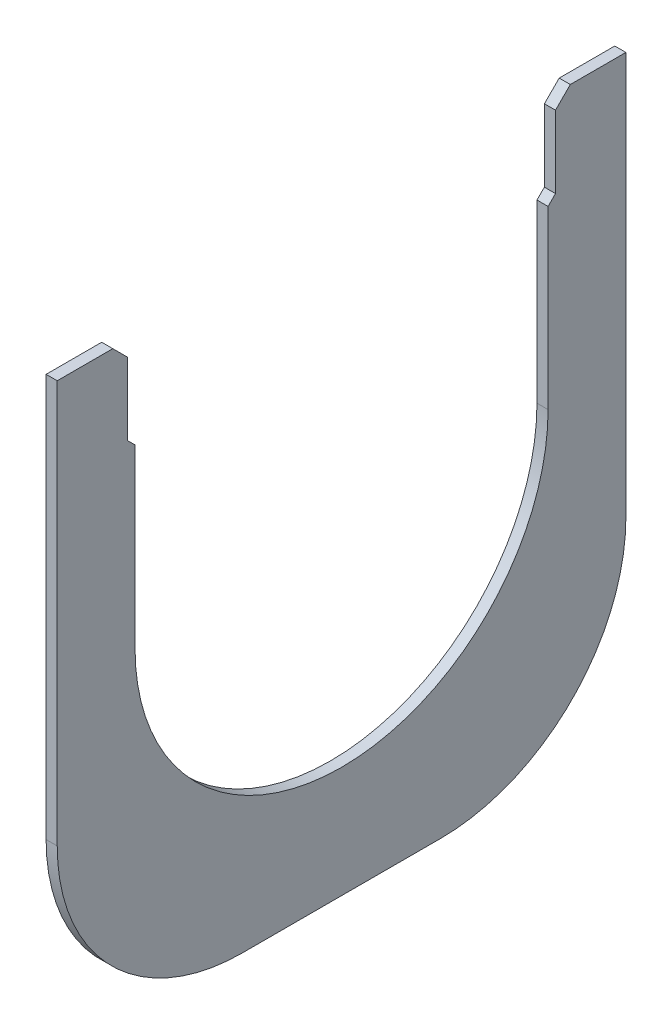
ISO-10303-21;
HEADER;
FILE_DESCRIPTION(('STEP AP214'),'2;1');
FILE_NAME('part.step','',(''),(''),'','','');
FILE_SCHEMA(('AUTOMOTIVE_DESIGN { 1 0 10303 214 1 1 1 1 }'));
ENDSEC;
DATA;
#1=APPLICATION_CONTEXT('core data for automotive mechanical design processes');
#2=APPLICATION_PROTOCOL_DEFINITION('international standard','automotive_design',2000,#1);
#3=PRODUCT_CONTEXT('',#1,'mechanical');
#4=PRODUCT('Part','Part','',(#3));
#5=PRODUCT_RELATED_PRODUCT_CATEGORY('part','',(#4));
#6=PRODUCT_DEFINITION_FORMATION('','',#4);
#7=PRODUCT_DEFINITION_CONTEXT('part definition',#1,'design');
#8=PRODUCT_DEFINITION('design','',#6,#7);
#9=PRODUCT_DEFINITION_SHAPE('','',#8);
#10=(LENGTH_UNIT() NAMED_UNIT(*) SI_UNIT(.MILLI.,.METRE.));
#11=(NAMED_UNIT(*) PLANE_ANGLE_UNIT() SI_UNIT($,.RADIAN.));
#12=(NAMED_UNIT(*) SI_UNIT($,.STERADIAN.) SOLID_ANGLE_UNIT());
#13=UNCERTAINTY_MEASURE_WITH_UNIT(LENGTH_MEASURE(1.E-05),#10,'distance_accuracy_value','');
#14=(GEOMETRIC_REPRESENTATION_CONTEXT(3) GLOBAL_UNCERTAINTY_ASSIGNED_CONTEXT((#13)) GLOBAL_UNIT_ASSIGNED_CONTEXT((#10,
#11,#12)) REPRESENTATION_CONTEXT('',''));
#15=CARTESIAN_POINT('',(0.,0.,0.));
#16=DIRECTION('',(0.,0.,1.));
#17=DIRECTION('',(1.,0.,0.));
#18=AXIS2_PLACEMENT_3D('',#15,#16,#17);
#19=CARTESIAN_POINT('',(-3.,146.,111.5));
#20=DIRECTION('',(0.,1.,0.));
#21=DIRECTION('',(0.,0.,1.));
#22=AXIS2_PLACEMENT_3D('',#19,#20,#21);
#23=PLANE('',#22);
#24=DIRECTION('',(0.,0.,1.));
#25=VECTOR('',#24,1.);
#26=CARTESIAN_POINT('',(3.,146.,111.5));
#27=LINE('',#26,#25);
#28=CARTESIAN_POINT('',(3.,146.,123.5));
#29=VERTEX_POINT('',#28);
#30=CARTESIAN_POINT('',(3.,146.,153.5));
#31=VERTEX_POINT('',#30);
#32=EDGE_CURVE('E198',#29,#31,#27,.T.);
#33=ORIENTED_EDGE('',*,*,#32,.F.);
#34=DIRECTION('',(-1.,0.,0.));
#35=VECTOR('',#34,1.);
#36=CARTESIAN_POINT('',(-3.,146.,123.5));
#37=LINE('',#36,#35);
#38=CARTESIAN_POINT('',(-3.,146.,123.5));
#39=VERTEX_POINT('',#38);
#40=EDGE_CURVE('E183',#29,#39,#37,.T.);
#41=ORIENTED_EDGE('',*,*,#40,.T.);
#42=DIRECTION('',(0.,0.,1.));
#43=VECTOR('',#42,1.);
#44=CARTESIAN_POINT('',(-3.,146.,111.5));
#45=LINE('',#44,#43);
#46=CARTESIAN_POINT('',(-3.,146.,153.5));
#47=VERTEX_POINT('',#46);
#48=EDGE_CURVE('E218',#39,#47,#45,.T.);
#49=ORIENTED_EDGE('',*,*,#48,.T.);
#50=DIRECTION('',(1.,0.,0.));
#51=VECTOR('',#50,1.);
#52=CARTESIAN_POINT('',(-3.,146.,153.5));
#53=LINE('',#52,#51);
#54=EDGE_CURVE('E254',#47,#31,#53,.T.);
#55=ORIENTED_EDGE('',*,*,#54,.T.);
#56=EDGE_LOOP('',(#33,#41,#49,#55));
#57=FACE_BOUND('',#56,.T.);
#58=ADVANCED_FACE('F53',(#57),#23,.T.);
#59=CARTESIAN_POINT('',(-3.,0.,111.5));
#60=DIRECTION('',(0.,0.,-1.));
#61=DIRECTION('',(-1.,0.,0.));
#62=AXIS2_PLACEMENT_3D('',#59,#60,#61);
#63=PLANE('',#62);
#64=DIRECTION('',(0.,1.,0.));
#65=VECTOR('',#64,1.);
#66=CARTESIAN_POINT('',(-3.,0.,111.5));
#67=LINE('',#66,#65);
#68=CARTESIAN_POINT('',(-3.,0.,111.5));
#69=VERTEX_POINT('',#68);
#70=CARTESIAN_POINT('',(-3.,95.,111.5));
#71=VERTEX_POINT('',#70);
#72=EDGE_CURVE('E252',#69,#71,#67,.T.);
#73=ORIENTED_EDGE('',*,*,#72,.T.);
#74=DIRECTION('',(1.,0.,0.));
#75=VECTOR('',#74,1.);
#76=CARTESIAN_POINT('',(3.,95.,111.5));
#77=LINE('',#76,#75);
#78=CARTESIAN_POINT('',(3.,95.,111.5));
#79=VERTEX_POINT('',#78);
#80=EDGE_CURVE('E11',#71,#79,#77,.T.);
#81=ORIENTED_EDGE('',*,*,#80,.T.);
#82=DIRECTION('',(0.,1.,0.));
#83=VECTOR('',#82,1.);
#84=CARTESIAN_POINT('',(3.,0.,111.5));
#85=LINE('',#84,#83);
#86=CARTESIAN_POINT('',(3.,0.,111.5));
#87=VERTEX_POINT('',#86);
#88=EDGE_CURVE('E177',#87,#79,#85,.T.);
#89=ORIENTED_EDGE('',*,*,#88,.F.);
#90=DIRECTION('',(1.,0.,0.));
#91=VECTOR('',#90,1.);
#92=CARTESIAN_POINT('',(-3.,0.,111.5));
#93=LINE('',#92,#91);
#94=EDGE_CURVE('E287',#69,#87,#93,.T.);
#95=ORIENTED_EDGE('',*,*,#94,.F.);
#96=EDGE_LOOP('',(#73,#81,#89,#95));
#97=FACE_BOUND('',#96,.T.);
#98=ADVANCED_FACE('F359',(#97),#63,.T.);
#99=CARTESIAN_POINT('',(-3.,0.,0.));
#100=DIRECTION('',(1.,0.,0.));
#101=DIRECTION('',(0.,0.,-1.));
#102=AXIS2_PLACEMENT_3D('',#99,#100,#101);
#103=CYLINDRICAL_SURFACE('',#102,111.5);
#104=CARTESIAN_POINT('',(3.,0.,0.));
#105=DIRECTION('',(-1.,0.,0.));
#106=DIRECTION('',(0.,0.,-1.));
#107=AXIS2_PLACEMENT_3D('',#104,#105,#106);
#108=CIRCLE('',#107,111.5);
#109=CARTESIAN_POINT('',(3.,0.,-111.5));
#110=VERTEX_POINT('',#109);
#111=EDGE_CURVE('E282',#110,#87,#108,.T.);
#112=ORIENTED_EDGE('',*,*,#111,.F.);
#113=DIRECTION('',(1.,0.,0.));
#114=VECTOR('',#113,1.);
#115=CARTESIAN_POINT('',(-3.,0.,-111.5));
#116=LINE('',#115,#114);
#117=CARTESIAN_POINT('',(-3.,0.,-111.5));
#118=VERTEX_POINT('',#117);
#119=EDGE_CURVE('E291',#118,#110,#116,.T.);
#120=ORIENTED_EDGE('',*,*,#119,.F.);
#121=CARTESIAN_POINT('',(-3.,0.,0.));
#122=DIRECTION('',(-1.,0.,0.));
#123=DIRECTION('',(0.,0.,-1.));
#124=AXIS2_PLACEMENT_3D('',#121,#122,#123);
#125=CIRCLE('',#124,111.5);
#126=EDGE_CURVE('E248',#118,#69,#125,.T.);
#127=ORIENTED_EDGE('',*,*,#126,.T.);
#128=ORIENTED_EDGE('',*,*,#94,.T.);
#129=EDGE_LOOP('',(#112,#120,#127,#128));
#130=FACE_BOUND('',#129,.T.);
#131=ADVANCED_FACE('F357',(#130),#103,.F.);
#132=CARTESIAN_POINT('',(-3.,0.,-111.5));
#133=DIRECTION('',(0.,0.,1.));
#134=DIRECTION('',(1.,0.,0.));
#135=AXIS2_PLACEMENT_3D('',#132,#133,#134);
#136=PLANE('',#135);
#137=DIRECTION('',(0.,-1.,0.));
#138=VECTOR('',#137,1.);
#139=CARTESIAN_POINT('',(3.,0.,-111.5));
#140=LINE('',#139,#138);
#141=CARTESIAN_POINT('',(3.,95.,-111.5));
#142=VERTEX_POINT('',#141);
#143=EDGE_CURVE('E279',#142,#110,#140,.T.);
#144=ORIENTED_EDGE('',*,*,#143,.F.);
#145=DIRECTION('',(-1.,0.,0.));
#146=VECTOR('',#145,1.);
#147=CARTESIAN_POINT('',(-3.,95.,-111.5));
#148=LINE('',#147,#146);
#149=CARTESIAN_POINT('',(-3.,95.,-111.5));
#150=VERTEX_POINT('',#149);
#151=EDGE_CURVE('E78',#142,#150,#148,.T.);
#152=ORIENTED_EDGE('',*,*,#151,.T.);
#153=DIRECTION('',(0.,-1.,0.));
#154=VECTOR('',#153,1.);
#155=CARTESIAN_POINT('',(-3.,0.,-111.5));
#156=LINE('',#155,#154);
#157=EDGE_CURVE('E245',#150,#118,#156,.T.);
#158=ORIENTED_EDGE('',*,*,#157,.T.);
#159=ORIENTED_EDGE('',*,*,#119,.T.);
#160=EDGE_LOOP('',(#144,#152,#158,#159));
#161=FACE_BOUND('',#160,.T.);
#162=ADVANCED_FACE('F353',(#161),#136,.T.);
#163=CARTESIAN_POINT('',(-3.,146.,-111.5));
#164=DIRECTION('',(0.,1.,0.));
#165=DIRECTION('',(0.,0.,1.));
#166=AXIS2_PLACEMENT_3D('',#163,#164,#165);
#167=PLANE('',#166);
#168=DIRECTION('',(0.,0.,1.));
#169=VECTOR('',#168,1.);
#170=CARTESIAN_POINT('',(-3.,146.,-111.5));
#171=LINE('',#170,#169);
#172=CARTESIAN_POINT('',(-3.,146.,-153.5));
#173=VERTEX_POINT('',#172);
#174=CARTESIAN_POINT('',(-3.,146.,-123.5));
#175=VERTEX_POINT('',#174);
#176=EDGE_CURVE('E241',#173,#175,#171,.T.);
#177=ORIENTED_EDGE('',*,*,#176,.T.);
#178=DIRECTION('',(1.,0.,0.));
#179=VECTOR('',#178,1.);
#180=CARTESIAN_POINT('',(3.,146.,-123.5));
#181=LINE('',#180,#179);
#182=CARTESIAN_POINT('',(3.,146.,-123.5));
#183=VERTEX_POINT('',#182);
#184=EDGE_CURVE('E290',#175,#183,#181,.T.);
#185=ORIENTED_EDGE('',*,*,#184,.T.);
#186=DIRECTION('',(0.,0.,1.));
#187=VECTOR('',#186,1.);
#188=CARTESIAN_POINT('',(3.,146.,-111.5));
#189=LINE('',#188,#187);
#190=CARTESIAN_POINT('',(3.,146.,-153.5));
#191=VERTEX_POINT('',#190);
#192=EDGE_CURVE('E275',#191,#183,#189,.T.);
#193=ORIENTED_EDGE('',*,*,#192,.F.);
#194=DIRECTION('',(1.,0.,0.));
#195=VECTOR('',#194,1.);
#196=CARTESIAN_POINT('',(-3.,146.,-153.5));
#197=LINE('',#196,#195);
#198=EDGE_CURVE('E295',#173,#191,#197,.T.);
#199=ORIENTED_EDGE('',*,*,#198,.F.);
#200=EDGE_LOOP('',(#177,#185,#193,#199));
#201=FACE_BOUND('',#200,.T.);
#202=ADVANCED_FACE('F375',(#201),#167,.T.);
#203=CARTESIAN_POINT('',(-3.,146.,-153.5));
#204=DIRECTION('',(0.,0.,-1.));
#205=DIRECTION('',(0.,1.,0.));
#206=AXIS2_PLACEMENT_3D('',#203,#204,#205);
#207=PLANE('',#206);
#208=DIRECTION('',(0.,1.,0.));
#209=VECTOR('',#208,1.);
#210=CARTESIAN_POINT('',(3.,146.,-153.5));
#211=LINE('',#210,#209);
#212=CARTESIAN_POINT('',(3.,-71.4999999999993,-153.5));
#213=VERTEX_POINT('',#212);
#214=EDGE_CURVE('E271',#213,#191,#211,.T.);
#215=ORIENTED_EDGE('',*,*,#214,.F.);
#216=DIRECTION('',(1.,0.,0.));
#217=VECTOR('',#216,1.);
#218=CARTESIAN_POINT('',(-3.,-71.4999999999993,-153.5));
#219=LINE('',#218,#217);
#220=CARTESIAN_POINT('',(-3.,-71.4999999999993,-153.5));
#221=VERTEX_POINT('',#220);
#222=EDGE_CURVE('E298',#221,#213,#219,.T.);
#223=ORIENTED_EDGE('',*,*,#222,.F.);
#224=DIRECTION('',(0.,1.,0.));
#225=VECTOR('',#224,1.);
#226=CARTESIAN_POINT('',(-3.,146.,-153.5));
#227=LINE('',#226,#225);
#228=EDGE_CURVE('E237',#221,#173,#227,.T.);
#229=ORIENTED_EDGE('',*,*,#228,.T.);
#230=ORIENTED_EDGE('',*,*,#198,.T.);
#231=EDGE_LOOP('',(#215,#223,#229,#230));
#232=FACE_BOUND('',#231,.T.);
#233=ADVANCED_FACE('F378',(#232),#207,.T.);
#234=CARTESIAN_POINT('',(-3.,-71.5,-53.5));
#235=DIRECTION('',(1.,0.,0.));
#236=DIRECTION('',(0.,0.,-1.));
#237=AXIS2_PLACEMENT_3D('',#234,#235,#236);
#238=CYLINDRICAL_SURFACE('',#237,100.);
#239=CARTESIAN_POINT('',(3.,-71.5,-53.5));
#240=DIRECTION('',(1.,0.,0.));
#241=DIRECTION('',(0.,0.,-1.));
#242=AXIS2_PLACEMENT_3D('',#239,#240,#241);
#243=CIRCLE('',#242,100.);
#244=CARTESIAN_POINT('',(3.,-171.5,-53.4999999999993));
#245=VERTEX_POINT('',#244);
#246=EDGE_CURVE('E267',#245,#213,#243,.T.);
#247=ORIENTED_EDGE('',*,*,#246,.F.);
#248=DIRECTION('',(1.,0.,0.));
#249=VECTOR('',#248,1.);
#250=CARTESIAN_POINT('',(-3.,-171.5,-53.4999999999993));
#251=LINE('',#250,#249);
#252=CARTESIAN_POINT('',(-3.,-171.5,-53.4999999999993));
#253=VERTEX_POINT('',#252);
#254=EDGE_CURVE('E301',#253,#245,#251,.T.);
#255=ORIENTED_EDGE('',*,*,#254,.F.);
#256=CARTESIAN_POINT('',(-3.,-71.5,-53.5));
#257=DIRECTION('',(1.,0.,0.));
#258=DIRECTION('',(0.,0.,-1.));
#259=AXIS2_PLACEMENT_3D('',#256,#257,#258);
#260=CIRCLE('',#259,100.);
#261=EDGE_CURVE('E233',#253,#221,#260,.T.);
#262=ORIENTED_EDGE('',*,*,#261,.T.);
#263=ORIENTED_EDGE('',*,*,#222,.T.);
#264=EDGE_LOOP('',(#247,#255,#262,#263));
#265=FACE_BOUND('',#264,.T.);
#266=ADVANCED_FACE('F382',(#265),#238,.T.);
#267=CARTESIAN_POINT('',(-3.,-171.5,53.4999999999993));
#268=DIRECTION('',(0.,-1.,0.));
#269=DIRECTION('',(0.,0.,-1.));
#270=AXIS2_PLACEMENT_3D('',#267,#268,#269);
#271=PLANE('',#270);
#272=DIRECTION('',(0.,0.,-1.));
#273=VECTOR('',#272,1.);
#274=CARTESIAN_POINT('',(3.,-171.5,53.4999999999993));
#275=LINE('',#274,#273);
#276=CARTESIAN_POINT('',(3.,-171.5,53.4999999999993));
#277=VERTEX_POINT('',#276);
#278=EDGE_CURVE('E263',#277,#245,#275,.T.);
#279=ORIENTED_EDGE('',*,*,#278,.F.);
#280=DIRECTION('',(1.,0.,0.));
#281=VECTOR('',#280,1.);
#282=CARTESIAN_POINT('',(-3.,-171.5,53.4999999999993));
#283=LINE('',#282,#281);
#284=CARTESIAN_POINT('',(-3.,-171.5,53.4999999999993));
#285=VERTEX_POINT('',#284);
#286=EDGE_CURVE('E304',#285,#277,#283,.T.);
#287=ORIENTED_EDGE('',*,*,#286,.F.);
#288=DIRECTION('',(0.,0.,-1.));
#289=VECTOR('',#288,1.);
#290=CARTESIAN_POINT('',(-3.,-171.5,53.4999999999993));
#291=LINE('',#290,#289);
#292=EDGE_CURVE('E229',#285,#253,#291,.T.);
#293=ORIENTED_EDGE('',*,*,#292,.T.);
#294=ORIENTED_EDGE('',*,*,#254,.T.);
#295=EDGE_LOOP('',(#279,#287,#293,#294));
#296=FACE_BOUND('',#295,.T.);
#297=ADVANCED_FACE('F386',(#296),#271,.T.);
#298=CARTESIAN_POINT('',(-3.,-71.5,53.5));
#299=DIRECTION('',(1.,0.,0.));
#300=DIRECTION('',(0.,0.,-1.));
#301=AXIS2_PLACEMENT_3D('',#298,#299,#300);
#302=CYLINDRICAL_SURFACE('',#301,100.);
#303=CARTESIAN_POINT('',(3.,-71.5,53.5));
#304=DIRECTION('',(1.,0.,0.));
#305=DIRECTION('',(0.,0.,-1.));
#306=AXIS2_PLACEMENT_3D('',#303,#304,#305);
#307=CIRCLE('',#306,100.);
#308=CARTESIAN_POINT('',(3.,-71.4999999999993,153.5));
#309=VERTEX_POINT('',#308);
#310=EDGE_CURVE('E259',#309,#277,#307,.T.);
#311=ORIENTED_EDGE('',*,*,#310,.F.);
#312=DIRECTION('',(1.,0.,0.));
#313=VECTOR('',#312,1.);
#314=CARTESIAN_POINT('',(-3.,-71.4999999999993,153.5));
#315=LINE('',#314,#313);
#316=CARTESIAN_POINT('',(-3.,-71.4999999999993,153.5));
#317=VERTEX_POINT('',#316);
#318=EDGE_CURVE('E307',#317,#309,#315,.T.);
#319=ORIENTED_EDGE('',*,*,#318,.F.);
#320=CARTESIAN_POINT('',(-3.,-71.5,53.5));
#321=DIRECTION('',(1.,0.,0.));
#322=DIRECTION('',(0.,0.,-1.));
#323=AXIS2_PLACEMENT_3D('',#320,#321,#322);
#324=CIRCLE('',#323,100.);
#325=EDGE_CURVE('E225',#317,#285,#324,.T.);
#326=ORIENTED_EDGE('',*,*,#325,.T.);
#327=ORIENTED_EDGE('',*,*,#286,.T.);
#328=EDGE_LOOP('',(#311,#319,#326,#327));
#329=FACE_BOUND('',#328,.T.);
#330=ADVANCED_FACE('F390',(#329),#302,.T.);
#331=CARTESIAN_POINT('',(-3.,146.,153.5));
#332=DIRECTION('',(0.,0.,1.));
#333=DIRECTION('',(0.,-1.,0.));
#334=AXIS2_PLACEMENT_3D('',#331,#332,#333);
#335=PLANE('',#334);
#336=DIRECTION('',(0.,-1.,0.));
#337=VECTOR('',#336,1.);
#338=CARTESIAN_POINT('',(3.,146.,153.5));
#339=LINE('',#338,#337);
#340=EDGE_CURVE('E203',#31,#309,#339,.T.);
#341=ORIENTED_EDGE('',*,*,#340,.F.);
#342=ORIENTED_EDGE('',*,*,#54,.F.);
#343=DIRECTION('',(0.,-1.,0.));
#344=VECTOR('',#343,1.);
#345=CARTESIAN_POINT('',(-3.,146.,153.5));
#346=LINE('',#345,#344);
#347=EDGE_CURVE('E221',#47,#317,#346,.T.);
#348=ORIENTED_EDGE('',*,*,#347,.T.);
#349=ORIENTED_EDGE('',*,*,#318,.T.);
#350=EDGE_LOOP('',(#341,#342,#348,#349));
#351=FACE_BOUND('',#350,.T.);
#352=ADVANCED_FACE('F394',(#351),#335,.T.);
#353=CARTESIAN_POINT('',(-3.,-71.5,53.5));
#354=DIRECTION('',(1.,0.,0.));
#355=DIRECTION('',(0.,0.,-1.));
#356=AXIS2_PLACEMENT_3D('',#353,#354,#355);
#357=PLANE('',#356);
#358=ORIENTED_EDGE('',*,*,#157,.F.);
#359=DIRECTION('',(0.,0.707106781186548,-0.707106781186548));
#360=VECTOR('',#359,1.);
#361=CARTESIAN_POINT('',(-3.,99.,-115.5));
#362=LINE('',#361,#360);
#363=CARTESIAN_POINT('',(-3.,99.,-115.5));
#364=VERTEX_POINT('',#363);
#365=EDGE_CURVE('E63',#150,#364,#362,.T.);
#366=ORIENTED_EDGE('',*,*,#365,.T.);
#367=DIRECTION('',(0.,1.,0.));
#368=VECTOR('',#367,1.);
#369=CARTESIAN_POINT('',(-3.,146.,-115.5));
#370=LINE('',#369,#368);
#371=CARTESIAN_POINT('',(-3.,138.,-115.5));
#372=VERTEX_POINT('',#371);
#373=EDGE_CURVE('E211',#364,#372,#370,.T.);
#374=ORIENTED_EDGE('',*,*,#373,.T.);
#375=DIRECTION('',(0.,0.70710678118655,-0.707106781186545));
#376=VECTOR('',#375,1.);
#377=CARTESIAN_POINT('',(-3.,146.,-123.5));
#378=LINE('',#377,#376);
#379=EDGE_CURVE('E328',#372,#175,#378,.T.);
#380=ORIENTED_EDGE('',*,*,#379,.T.);
#381=ORIENTED_EDGE('',*,*,#176,.F.);
#382=ORIENTED_EDGE('',*,*,#228,.F.);
#383=ORIENTED_EDGE('',*,*,#261,.F.);
#384=ORIENTED_EDGE('',*,*,#292,.F.);
#385=ORIENTED_EDGE('',*,*,#325,.F.);
#386=ORIENTED_EDGE('',*,*,#347,.F.);
#387=ORIENTED_EDGE('',*,*,#48,.F.);
#388=DIRECTION('',(0.,-0.707106781186545,-0.70710678118655));
#389=VECTOR('',#388,1.);
#390=CARTESIAN_POINT('',(-3.,138.,115.5));
#391=LINE('',#390,#389);
#392=CARTESIAN_POINT('',(-3.,138.,115.5));
#393=VERTEX_POINT('',#392);
#394=EDGE_CURVE('E325',#39,#393,#391,.T.);
#395=ORIENTED_EDGE('',*,*,#394,.T.);
#396=DIRECTION('',(0.,-1.,0.));
#397=VECTOR('',#396,1.);
#398=CARTESIAN_POINT('',(-3.,146.,115.5));
#399=LINE('',#398,#397);
#400=CARTESIAN_POINT('',(-3.,99.,115.5));
#401=VERTEX_POINT('',#400);
#402=EDGE_CURVE('E194',#393,#401,#399,.T.);
#403=ORIENTED_EDGE('',*,*,#402,.T.);
#404=DIRECTION('',(0.,-0.707106781186548,-0.707106781186548));
#405=VECTOR('',#404,1.);
#406=CARTESIAN_POINT('',(-3.,95.,111.5));
#407=LINE('',#406,#405);
#408=EDGE_CURVE('E70',#401,#71,#407,.T.);
#409=ORIENTED_EDGE('',*,*,#408,.T.);
#410=ORIENTED_EDGE('',*,*,#72,.F.);
#411=ORIENTED_EDGE('',*,*,#126,.F.);
#412=EDGE_LOOP('',(#358,#366,#374,#380,#381,#382,#383,#384,#385,#386,#387,#395,#403,#409,#410,#411));
#413=FACE_BOUND('',#412,.T.);
#414=ADVANCED_FACE('F344',(#413),#357,.F.);
#415=CARTESIAN_POINT('',(3.,-71.5,53.5));
#416=DIRECTION('',(1.,0.,0.));
#417=DIRECTION('',(0.,0.,-1.));
#418=AXIS2_PLACEMENT_3D('',#415,#416,#417);
#419=PLANE('',#418);
#420=DIRECTION('',(0.,1.,0.));
#421=VECTOR('',#420,1.);
#422=CARTESIAN_POINT('',(3.,146.,-115.5));
#423=LINE('',#422,#421);
#424=CARTESIAN_POINT('',(3.,99.,-115.5));
#425=VERTEX_POINT('',#424);
#426=CARTESIAN_POINT('',(3.,138.,-115.5));
#427=VERTEX_POINT('',#426);
#428=EDGE_CURVE('E195',#425,#427,#423,.T.);
#429=ORIENTED_EDGE('',*,*,#428,.F.);
#430=DIRECTION('',(0.,-0.707106781186548,0.707106781186548));
#431=VECTOR('',#430,1.);
#432=CARTESIAN_POINT('',(3.,-70.75,54.25));
#433=LINE('',#432,#431);
#434=EDGE_CURVE('E182',#425,#142,#433,.T.);
#435=ORIENTED_EDGE('',*,*,#434,.T.);
#436=ORIENTED_EDGE('',*,*,#143,.T.);
#437=ORIENTED_EDGE('',*,*,#111,.T.);
#438=ORIENTED_EDGE('',*,*,#88,.T.);
#439=DIRECTION('',(0.,0.707106781186548,0.707106781186548));
#440=VECTOR('',#439,1.);
#441=CARTESIAN_POINT('',(3.,-17.25,-0.750000000000015));
#442=LINE('',#441,#440);
#443=CARTESIAN_POINT('',(3.,99.,115.5));
#444=VERTEX_POINT('',#443);
#445=EDGE_CURVE('E170',#79,#444,#442,.T.);
#446=ORIENTED_EDGE('',*,*,#445,.T.);
#447=DIRECTION('',(0.,-1.,0.));
#448=VECTOR('',#447,1.);
#449=CARTESIAN_POINT('',(3.,146.,115.5));
#450=LINE('',#449,#448);
#451=CARTESIAN_POINT('',(3.,138.,115.5));
#452=VERTEX_POINT('',#451);
#453=EDGE_CURVE('E174',#452,#444,#450,.T.);
#454=ORIENTED_EDGE('',*,*,#453,.F.);
#455=DIRECTION('',(0.,0.707106781186545,0.70710678118655));
#456=VECTOR('',#455,1.);
#457=CARTESIAN_POINT('',(3.,2.25000000000064,-20.2500000000002));
#458=LINE('',#457,#456);
#459=EDGE_CURVE('E316',#452,#29,#458,.T.);
#460=ORIENTED_EDGE('',*,*,#459,.T.);
#461=ORIENTED_EDGE('',*,*,#32,.T.);
#462=ORIENTED_EDGE('',*,*,#340,.T.);
#463=ORIENTED_EDGE('',*,*,#310,.T.);
#464=ORIENTED_EDGE('',*,*,#278,.T.);
#465=ORIENTED_EDGE('',*,*,#246,.T.);
#466=ORIENTED_EDGE('',*,*,#214,.T.);
#467=ORIENTED_EDGE('',*,*,#192,.T.);
#468=DIRECTION('',(0.,-0.70710678118655,0.707106781186545));
#469=VECTOR('',#468,1.);
#470=CARTESIAN_POINT('',(3.,-51.2500000000008,73.7499999999994));
#471=LINE('',#470,#469);
#472=EDGE_CURVE('E319',#183,#427,#471,.T.);
#473=ORIENTED_EDGE('',*,*,#472,.T.);
#474=EDGE_LOOP('',(#429,#435,#436,#437,#438,#446,#454,#460,#461,#462,#463,#464,#465,#466,#467,#473));
#475=FACE_BOUND('',#474,.T.);
#476=ADVANCED_FACE('F173',(#475),#419,.T.);
#477=CARTESIAN_POINT('',(-3.,146.,-115.5));
#478=DIRECTION('',(0.,0.,-1.));
#479=DIRECTION('',(-1.,0.,0.));
#480=AXIS2_PLACEMENT_3D('',#477,#478,#479);
#481=PLANE('',#480);
#482=ORIENTED_EDGE('',*,*,#428,.T.);
#483=DIRECTION('',(-1.,0.,0.));
#484=VECTOR('',#483,1.);
#485=CARTESIAN_POINT('',(-3.,138.,-115.5));
#486=LINE('',#485,#484);
#487=EDGE_CURVE('E322',#427,#372,#486,.T.);
#488=ORIENTED_EDGE('',*,*,#487,.T.);
#489=ORIENTED_EDGE('',*,*,#373,.F.);
#490=DIRECTION('',(1.,0.,0.));
#491=VECTOR('',#490,1.);
#492=CARTESIAN_POINT('',(-3.,99.,-115.5));
#493=LINE('',#492,#491);
#494=EDGE_CURVE('E207',#364,#425,#493,.T.);
#495=ORIENTED_EDGE('',*,*,#494,.T.);
#496=EDGE_LOOP('',(#482,#488,#489,#495));
#497=FACE_BOUND('',#496,.T.);
#498=ADVANCED_FACE('F350',(#497),#481,.F.);
#499=CARTESIAN_POINT('',(-3.,146.,115.5));
#500=DIRECTION('',(0.,0.,1.));
#501=DIRECTION('',(0.,-1.,0.));
#502=AXIS2_PLACEMENT_3D('',#499,#500,#501);
#503=PLANE('',#502);
#504=ORIENTED_EDGE('',*,*,#402,.F.);
#505=DIRECTION('',(1.,0.,0.));
#506=VECTOR('',#505,1.);
#507=CARTESIAN_POINT('',(3.,138.,115.5));
#508=LINE('',#507,#506);
#509=EDGE_CURVE('E192',#393,#452,#508,.T.);
#510=ORIENTED_EDGE('',*,*,#509,.T.);
#511=ORIENTED_EDGE('',*,*,#453,.T.);
#512=DIRECTION('',(1.,0.,0.));
#513=VECTOR('',#512,1.);
#514=CARTESIAN_POINT('',(-3.,99.,115.5));
#515=LINE('',#514,#513);
#516=EDGE_CURVE('E190',#401,#444,#515,.T.);
#517=ORIENTED_EDGE('',*,*,#516,.F.);
#518=EDGE_LOOP('',(#504,#510,#511,#517));
#519=FACE_BOUND('',#518,.T.);
#520=ADVANCED_FACE('F189',(#519),#503,.F.);
#521=CARTESIAN_POINT('',(-3.,146.,-123.5));
#522=DIRECTION('',(0.,0.707106781186545,0.70710678118655));
#523=DIRECTION('',(-1.,0.,0.));
#524=AXIS2_PLACEMENT_3D('',#521,#522,#523);
#525=PLANE('',#524);
#526=ORIENTED_EDGE('',*,*,#379,.F.);
#527=ORIENTED_EDGE('',*,*,#487,.F.);
#528=ORIENTED_EDGE('',*,*,#472,.F.);
#529=ORIENTED_EDGE('',*,*,#184,.F.);
#530=EDGE_LOOP('',(#526,#527,#528,#529));
#531=FACE_BOUND('',#530,.T.);
#532=ADVANCED_FACE('F400',(#531),#525,.T.);
#533=CARTESIAN_POINT('',(-3.,138.,115.5));
#534=DIRECTION('',(0.,0.70710678118655,-0.707106781186545));
#535=DIRECTION('',(-1.,0.,0.));
#536=AXIS2_PLACEMENT_3D('',#533,#534,#535);
#537=PLANE('',#536);
#538=ORIENTED_EDGE('',*,*,#394,.F.);
#539=ORIENTED_EDGE('',*,*,#40,.F.);
#540=ORIENTED_EDGE('',*,*,#459,.F.);
#541=ORIENTED_EDGE('',*,*,#509,.F.);
#542=EDGE_LOOP('',(#538,#539,#540,#541));
#543=FACE_BOUND('',#542,.T.);
#544=ADVANCED_FACE('F406',(#543),#537,.T.);
#545=CARTESIAN_POINT('',(-3.,99.,-115.5));
#546=DIRECTION('',(0.,0.707106781186547,0.707106781186547));
#547=DIRECTION('',(-1.,0.,0.));
#548=AXIS2_PLACEMENT_3D('',#545,#546,#547);
#549=PLANE('',#548);
#550=ORIENTED_EDGE('',*,*,#365,.F.);
#551=ORIENTED_EDGE('',*,*,#151,.F.);
#552=ORIENTED_EDGE('',*,*,#434,.F.);
#553=ORIENTED_EDGE('',*,*,#494,.F.);
#554=EDGE_LOOP('',(#550,#551,#552,#553));
#555=FACE_BOUND('',#554,.T.);
#556=ADVANCED_FACE('F352',(#555),#549,.T.);
#557=CARTESIAN_POINT('',(-3.,95.,111.5));
#558=DIRECTION('',(0.,0.707106781186547,-0.707106781186547));
#559=DIRECTION('',(-1.,0.,0.));
#560=AXIS2_PLACEMENT_3D('',#557,#558,#559);
#561=PLANE('',#560);
#562=ORIENTED_EDGE('',*,*,#408,.F.);
#563=ORIENTED_EDGE('',*,*,#516,.T.);
#564=ORIENTED_EDGE('',*,*,#445,.F.);
#565=ORIENTED_EDGE('',*,*,#80,.F.);
#566=EDGE_LOOP('',(#562,#563,#564,#565));
#567=FACE_BOUND('',#566,.T.);
#568=ADVANCED_FACE('F56',(#567),#561,.T.);
#569=CLOSED_SHELL('',(#58,#98,#131,#162,#202,#233,#266,#297,#330,#352,#414,#476,#498,#520,#532,
#544,#556,#568));
#570=MANIFOLD_SOLID_BREP('B2',#569);
#571=ADVANCED_BREP_SHAPE_REPRESENTATION('',(#18,#570),#14);
#572=SHAPE_DEFINITION_REPRESENTATION(#9,#571);
ENDSEC;
END-ISO-10303-21;
